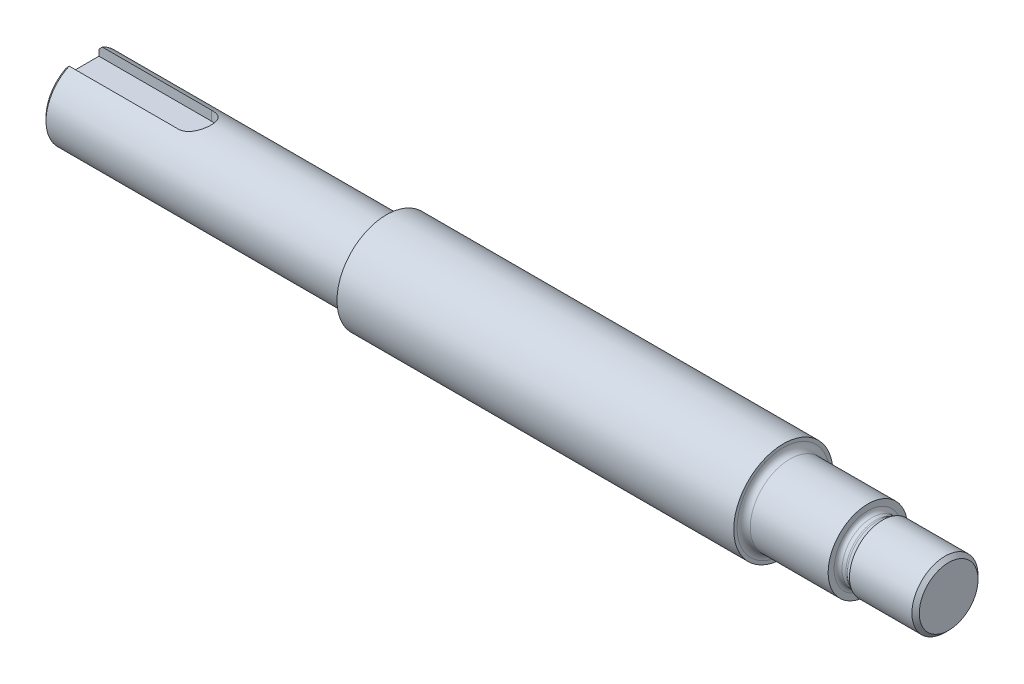
ISO-10303-21;
HEADER;
FILE_DESCRIPTION(('STEP AP214'),'2;1');
FILE_NAME('part.step','',(''),(''),'','','');
FILE_SCHEMA(('AUTOMOTIVE_DESIGN { 1 0 10303 214 1 1 1 1 }'));
ENDSEC;
DATA;
#1=APPLICATION_CONTEXT('core data for automotive mechanical design processes');
#2=APPLICATION_PROTOCOL_DEFINITION('international standard','automotive_design',2000,#1);
#3=PRODUCT_CONTEXT('',#1,'mechanical');
#4=PRODUCT('Part','Part','',(#3));
#5=PRODUCT_RELATED_PRODUCT_CATEGORY('part','',(#4));
#6=PRODUCT_DEFINITION_FORMATION('','',#4);
#7=PRODUCT_DEFINITION_CONTEXT('part definition',#1,'design');
#8=PRODUCT_DEFINITION('design','',#6,#7);
#9=PRODUCT_DEFINITION_SHAPE('','',#8);
#10=(LENGTH_UNIT() NAMED_UNIT(*) SI_UNIT(.MILLI.,.METRE.));
#11=(NAMED_UNIT(*) PLANE_ANGLE_UNIT() SI_UNIT($,.RADIAN.));
#12=(NAMED_UNIT(*) SI_UNIT($,.STERADIAN.) SOLID_ANGLE_UNIT());
#13=UNCERTAINTY_MEASURE_WITH_UNIT(LENGTH_MEASURE(1.E-05),#10,'distance_accuracy_value','');
#14=(GEOMETRIC_REPRESENTATION_CONTEXT(3) GLOBAL_UNCERTAINTY_ASSIGNED_CONTEXT((#13)) GLOBAL_UNIT_ASSIGNED_CONTEXT((#10,
#11,#12)) REPRESENTATION_CONTEXT('',''));
#15=CARTESIAN_POINT('',(0.,0.,0.));
#16=DIRECTION('',(0.,0.,1.));
#17=DIRECTION('',(1.,0.,0.));
#18=AXIS2_PLACEMENT_3D('',#15,#16,#17);
#19=CARTESIAN_POINT('',(0.,0.,0.));
#20=DIRECTION('',(-1.,0.,0.));
#21=DIRECTION('',(0.,0.,1.));
#22=AXIS2_PLACEMENT_3D('',#19,#20,#21);
#23=PLANE('',#22);
#24=DIRECTION('',(0.,0.,1.));
#25=VECTOR('',#24,1.);
#26=CARTESIAN_POINT('',(0.,4.,0.));
#27=LINE('',#26,#25);
#28=CARTESIAN_POINT('',(0.,4.,-2.5));
#29=VERTEX_POINT('',#28);
#30=CARTESIAN_POINT('',(0.,4.,2.5));
#31=VERTEX_POINT('',#30);
#32=EDGE_CURVE('E12',#29,#31,#27,.T.);
#33=ORIENTED_EDGE('',*,*,#32,.F.);
#34=DIRECTION('',(0.,1.,0.));
#35=VECTOR('',#34,1.);
#36=CARTESIAN_POINT('',(0.,0.,-2.5));
#37=LINE('',#36,#35);
#38=CARTESIAN_POINT('',(0.,4.89897948556635,-2.5));
#39=VERTEX_POINT('',#38);
#40=EDGE_CURVE('E291',#29,#39,#37,.T.);
#41=ORIENTED_EDGE('',*,*,#40,.T.);
#42=CARTESIAN_POINT('',(0.,0.,0.));
#43=DIRECTION('',(-1.,0.,0.));
#44=DIRECTION('',(0.,0.,1.));
#45=AXIS2_PLACEMENT_3D('',#42,#43,#44);
#46=CIRCLE('',#45,5.49999999999999);
#47=CARTESIAN_POINT('',(0.,4.89897948556635,2.5));
#48=VERTEX_POINT('',#47);
#49=EDGE_CURVE('E372',#39,#48,#46,.T.);
#50=ORIENTED_EDGE('',*,*,#49,.T.);
#51=DIRECTION('',(0.,-1.,0.));
#52=VECTOR('',#51,1.);
#53=CARTESIAN_POINT('',(0.,0.,2.5));
#54=LINE('',#53,#52);
#55=EDGE_CURVE('E244',#48,#31,#54,.T.);
#56=ORIENTED_EDGE('',*,*,#55,.T.);
#57=EDGE_LOOP('',(#33,#41,#50,#56));
#58=FACE_BOUND('',#57,.T.);
#59=ADVANCED_FACE('F226',(#58),#23,.T.);
#60=CARTESIAN_POINT('',(0.,0.,0.));
#61=DIRECTION('',(-1.,0.,0.));
#62=DIRECTION('',(0.,0.,1.));
#63=AXIS2_PLACEMENT_3D('',#60,#61,#62);
#64=CYLINDRICAL_SURFACE('',#63,6.);
#65=CARTESIAN_POINT('',(45.,0.,0.));
#66=DIRECTION('',(-1.,0.,0.));
#67=DIRECTION('',(0.,0.,1.));
#68=AXIS2_PLACEMENT_3D('',#65,#66,#67);
#69=CIRCLE('',#68,6.);
#70=CARTESIAN_POINT('',(45.,0.,6.));
#71=VERTEX_POINT('',#70);
#72=EDGE_CURVE('E356',#71,#71,#69,.T.);
#73=ORIENTED_EDGE('',*,*,#72,.T.);
#74=EDGE_LOOP('',(#73));
#75=FACE_BOUND('',#74,.T.);
#76=CARTESIAN_POINT('',(0.500000000000017,0.,0.));
#77=DIRECTION('',(-1.,0.,0.));
#78=DIRECTION('',(0.,0.,1.));
#79=AXIS2_PLACEMENT_3D('',#76,#77,#78);
#80=CIRCLE('',#79,6.);
#81=CARTESIAN_POINT('',(0.500000000000017,5.45435605731786,2.5));
#82=VERTEX_POINT('',#81);
#83=CARTESIAN_POINT('',(0.499999999999799,5.45435605731776,-2.5));
#84=VERTEX_POINT('',#83);
#85=EDGE_CURVE('E376',#82,#84,#80,.F.);
#86=ORIENTED_EDGE('',*,*,#85,.T.);
#87=DIRECTION('',(-1.,0.,0.));
#88=VECTOR('',#87,1.);
#89=CARTESIAN_POINT('',(0.,5.45435605731786,-2.5));
#90=LINE('',#89,#88);
#91=CARTESIAN_POINT('',(17.,5.45435605731786,-2.5));
#92=VERTEX_POINT('',#91);
#93=EDGE_CURVE('E252',#84,#92,#90,.F.);
#94=ORIENTED_EDGE('',*,*,#93,.T.);
#95=CARTESIAN_POINT('',(17.,5.45435605731786,-2.5));
#96=CARTESIAN_POINT('',(17.066990421397,5.4543414367274,-2.50001024965806));
#97=CARTESIAN_POINT('',(17.1339728576071,5.45558986423115,-2.49730766074456));
#98=CARTESIAN_POINT('',(17.267391217606,5.46050344433192,-2.48655699342007));
#99=CARTESIAN_POINT('',(17.3338273558978,5.46416759753227,-2.47851112553775));
#100=CARTESIAN_POINT('',(17.4654018598714,5.47378318611766,-2.45719882557102));
#101=CARTESIAN_POINT('',(17.5305445048847,5.47972494833872,-2.44395446621823));
#102=CARTESIAN_POINT('',(17.6593476505706,5.49369035165668,-2.41239773056354));
#103=CARTESIAN_POINT('',(17.7230080494492,5.50171413528084,-2.39408500729503));
#104=CARTESIAN_POINT('',(17.9109704766892,5.52852216859036,-2.33184505253746));
#105=CARTESIAN_POINT('',(18.0325349409199,5.55006534458072,-2.28056973965757));
#106=CARTESIAN_POINT('',(18.265394969978,5.5980502687434,-2.16009667726577));
#107=CARTESIAN_POINT('',(18.3766796624162,5.62449711638193,-2.09088024017803));
#108=CARTESIAN_POINT('',(18.5926555180297,5.68111739532849,-1.93194216605247));
#109=CARTESIAN_POINT('',(18.6966314637585,5.71141645652258,-1.84129131772597));
#110=CARTESIAN_POINT('',(18.8884169369691,5.77129106659512,-1.6440247325164));
#111=CARTESIAN_POINT('',(18.9762230019235,5.80086645933831,-1.53740558511416));
#112=CARTESIAN_POINT('',(19.1368988289762,5.85751079611205,-1.30552662419109));
#113=CARTESIAN_POINT('',(19.2089534877025,5.88441492036275,-1.17965801419142));
#114=CARTESIAN_POINT('',(19.3305523948046,5.93113050419022,-0.916263349803656));
#115=CARTESIAN_POINT('',(19.3801067434128,5.95094514533806,-0.778742558960749));
#116=CARTESIAN_POINT('',(19.4526785710471,5.98035028996094,-0.503538212911765));
#117=CARTESIAN_POINT('',(19.4769429460133,5.99041924152298,-0.366235636683352));
#118=CARTESIAN_POINT('',(19.502275267891,6.00093656296527,-0.0891608856613083));
#119=CARTESIAN_POINT('',(19.5033522066188,6.00138866214753,0.0506103107853688));
#120=CARTESIAN_POINT('',(19.4829313516378,5.99290254661358,0.319586702683723));
#121=CARTESIAN_POINT('',(19.4628034512649,5.98453414521297,0.448917245472143));
#122=CARTESIAN_POINT('',(19.4028930910878,5.96013005449445,0.70216796354397));
#123=CARTESIAN_POINT('',(19.3631095260154,5.94409393401056,0.826087834150438));
#124=CARTESIAN_POINT('',(19.2645442163381,5.90559715444489,1.06727556823007));
#125=CARTESIAN_POINT('',(19.2054818206956,5.88304219015531,1.1844130633202));
#126=CARTESIAN_POINT('',(19.0703092180309,5.83371457161593,1.40742238732223));
#127=CARTESIAN_POINT('',(18.9941928006955,5.80694038196897,1.51329009151026));
#128=CARTESIAN_POINT('',(18.8208409664575,5.74963576527152,1.71867537807254));
#129=CARTESIAN_POINT('',(18.7224958287417,5.71897359653013,1.81722082953265));
#130=CARTESIAN_POINT('',(18.5105893535751,5.65876079183101,1.99685313522822));
#131=CARTESIAN_POINT('',(18.3970203460054,5.62921072584973,2.07793113494236));
#132=CARTESIAN_POINT('',(18.1531453498455,5.57361619012468,2.22284514508404));
#133=CARTESIAN_POINT('',(18.0224071265261,5.54772171984214,2.28601504206341));
#134=CARTESIAN_POINT('',(17.7508546265431,5.50417661447929,2.38897619183128));
#135=CARTESIAN_POINT('',(17.6100594530022,5.48651080537515,2.4288105117282));
#136=CARTESIAN_POINT('',(17.3898491565922,5.46773287951056,2.47065526537902));
#137=CARTESIAN_POINT('',(17.3123689332134,5.46274303006064,2.48164099212927));
#138=CARTESIAN_POINT('',(17.1566098186605,5.45604541462647,2.49631631258703));
#139=CARTESIAN_POINT('',(17.0783312227393,5.45433647659977,2.50000851178052));
#140=CARTESIAN_POINT('',(17.,5.45435605731786,2.5));
#141=B_SPLINE_CURVE_WITH_KNOTS('',3,(#95,#96,#97,#98,#99,#100,#101,#102,#103,#104,#105,#106,
#107,#108,#109,#110,#111,#112,#113,#114,#115,#116,#117,#118,#119,#120,#121,#122,#123,#124,#125,
#126,#127,#128,#129,#130,#131,#132,#133,#134,#135,#136,#137,#138,#139,#140),.UNSPECIFIED.,.F.,
.F.,(4,2,2,2,2,2,2,2,2,2,2,2,2,2,2,2,2,2,2,2,2,2,4),(0.,0.200891876435008,0.401700695097973,
0.601665948391963,0.801644894158599,1.20075599352942,1.6002844916061,2.02212344548655,
2.44405262481498,2.88432120276328,3.32439195134774,3.74155898035476,4.15856423395471,
4.55019084443641,4.94183947919071,5.33946474085078,5.73723503589979,6.16301556467703,
6.58901142297275,7.02923147484728,7.4686364954648,7.70350874445825,7.93829707423866),.UNSPECIFIED.);
#142=CARTESIAN_POINT('',(17.,5.45435605731786,2.5));
#143=VERTEX_POINT('',#142);
#144=EDGE_CURVE('E237',#92,#143,#141,.T.);
#145=ORIENTED_EDGE('',*,*,#144,.T.);
#146=DIRECTION('',(-1.,0.,0.));
#147=VECTOR('',#146,1.);
#148=CARTESIAN_POINT('',(0.,5.45435605731786,2.5));
#149=LINE('',#148,#147);
#150=EDGE_CURVE('E284',#143,#82,#149,.T.);
#151=ORIENTED_EDGE('',*,*,#150,.T.);
#152=EDGE_LOOP('',(#86,#94,#145,#151));
#153=FACE_BOUND('',#152,.T.);
#154=ADVANCED_FACE('F413',(#75,#153),#64,.T.);
#155=CARTESIAN_POINT('',(0.,0.,0.));
#156=DIRECTION('',(1.,0.,0.));
#157=DIRECTION('',(0.,0.,-1.));
#158=AXIS2_PLACEMENT_3D('',#155,#156,#157);
#159=CONICAL_SURFACE('',#158,5.49999999999999,0.785398163397441);
#160=ORIENTED_EDGE('',*,*,#49,.F.);
#161=CARTESIAN_POINT('',(-2.06175281280883,2.36041176921064,-2.5));
#162=CARTESIAN_POINT('',(-2.01394475397447,2.43003661537907,-2.5));
#163=CARTESIAN_POINT('',(-1.96539366837906,2.49914412103413,-2.5));
#164=CARTESIAN_POINT('',(-1.8670237978404,2.63644147141834,-2.5));
#165=CARTESIAN_POINT('',(-1.8172051393184,2.70463140663225,-2.5));
#166=CARTESIAN_POINT('',(-1.66619894009737,2.90796953010818,-2.5));
#167=CARTESIAN_POINT('',(-1.56342461092271,3.04193862719923,-2.5));
#168=CARTESIAN_POINT('',(-1.35490770434356,3.30734106462791,-2.5));
#169=CARTESIAN_POINT('',(-1.24916779789332,3.43877651756389,-2.5));
#170=CARTESIAN_POINT('',(-1.03538561102648,3.69978141090577,-2.5));
#171=CARTESIAN_POINT('',(-0.927343076492302,3.82935064268389,-2.5));
#172=CARTESIAN_POINT('',(-0.709637065256824,4.08684420579855,-2.5));
#173=CARTESIAN_POINT('',(-0.599975737747148,4.21477035869308,-2.5));
#174=CARTESIAN_POINT('',(-0.37928339884431,4.46942490932702,-2.5));
#175=CARTESIAN_POINT('',(-0.268252440777538,4.59615335336187,-2.5));
#176=CARTESIAN_POINT('',(0.0665241148851471,4.97496249704816,-2.5));
#177=CARTESIAN_POINT('',(0.29189874404684,5.22560298461509,-2.5));
#178=CARTESIAN_POINT('',(0.686584004264704,5.6594708461063,-2.5));
#179=CARTESIAN_POINT('',(0.855245349383734,5.84329200676016,-2.5));
#180=CARTESIAN_POINT('',(1.19376958005533,6.20979019811357,-2.5));
#181=CARTESIAN_POINT('',(1.36363234151292,6.39246734340768,-2.5));
#182=CARTESIAN_POINT('',(1.70443176538093,6.75707362676224,-2.5));
#183=CARTESIAN_POINT('',(1.87536913992032,6.93900209824967,-2.5));
#184=CARTESIAN_POINT('',(2.218024761786,7.30215443708114,-2.5));
#185=CARTESIAN_POINT('',(2.38974308033959,7.48337823724012,-2.5));
#186=CARTESIAN_POINT('',(2.56175281280884,7.66432374152024,-2.5));
#187=B_SPLINE_CURVE_WITH_KNOTS('',3,(#161,#162,#163,#164,#165,#166,#167,#168,#169,#170,#171,
#172,#173,#174,#175,#176,#177,#178,#179,#180,#181,#182,#183,#184,#185,#186),.UNSPECIFIED.,.F.,
.F.,(4,2,2,2,2,2,2,2,2,2,2,2,4),(0.,0.253361589736587,0.506698008768662,1.01317878643961,
1.51921718977558,2.02531173159408,2.53078593021579,3.03624050999623,4.04740215903366,
4.79581734399679,5.54415632195695,6.29305861189881,7.04203063430377),.UNSPECIFIED.);
#188=EDGE_CURVE('E388',#39,#84,#187,.T.);
#189=ORIENTED_EDGE('',*,*,#188,.T.);
#190=ORIENTED_EDGE('',*,*,#85,.F.);
#191=CARTESIAN_POINT('',(2.56175281280885,7.66432374152023,2.5));
#192=CARTESIAN_POINT('',(2.35964348840291,7.45169986546314,2.5));
#193=CARTESIAN_POINT('',(2.15792493005194,7.23870137129957,2.5));
#194=CARTESIAN_POINT('',(1.75558602638068,6.81166549413486,2.5));
#195=CARTESIAN_POINT('',(1.55496569388227,6.59762809905927,2.5));
#196=CARTESIAN_POINT('',(1.15535677289204,6.16845752657041,2.5));
#197=CARTESIAN_POINT('',(0.956366678836541,5.95332575289029,2.5));
#198=CARTESIAN_POINT('',(0.560284990985788,5.52127964491234,2.5));
#199=CARTESIAN_POINT('',(0.363193581825832,5.30436514098102,2.5));
#200=CARTESIAN_POINT('',(-0.0285510942154846,4.8678578389933,2.5));
#201=CARTESIAN_POINT('',(-0.223201051255747,4.64826206545945,2.5));
#202=CARTESIAN_POINT('',(-0.608570055468194,4.20571324386406,2.5));
#203=CARTESIAN_POINT('',(-0.799290004049328,3.9827609864329,2.5));
#204=CARTESIAN_POINT('',(-1.08095604501516,3.64442132134884,2.5));
#205=CARTESIAN_POINT('',(-1.17416432438215,3.53091945299898,2.5));
#206=CARTESIAN_POINT('',(-1.35862799270255,3.30235252683684,2.5));
#207=CARTESIAN_POINT('',(-1.44988355232162,3.18728760708248,2.5));
#208=CARTESIAN_POINT('',(-1.62995148234885,2.9551071289415,2.5));
#209=CARTESIAN_POINT('',(-1.71876189262186,2.83799004183828,2.5));
#210=CARTESIAN_POINT('',(-1.84947212594601,2.66044235115342,2.5));
#211=CARTESIAN_POINT('',(-1.89263096341056,2.60093865736721,2.5));
#212=CARTESIAN_POINT('',(-1.97796609357188,2.48122489011144,2.5));
#213=CARTESIAN_POINT('',(-2.02014231464841,2.42101476562998,2.5));
#214=CARTESIAN_POINT('',(-2.06175281280841,2.36041176921125,2.5));
#215=B_SPLINE_CURVE_WITH_KNOTS('',3,(#191,#192,#193,#194,#195,#196,#197,#198,#199,#200,#201,
#202,#203,#204,#205,#206,#207,#208,#209,#210,#211,#212,#213,#214),.UNSPECIFIED.,.F.,.F.,(4,2,2,
2,2,2,2,2,2,2,2,4),(0.,0.880067668652409,1.7601455903537,2.6392896575659,3.51851837016957,
4.39883236708537,5.27894215070597,5.71953235599018,6.16008389556549,6.60097888262755,
6.82149293574366,7.04202301156287),.UNSPECIFIED.);
#216=EDGE_CURVE('E380',#82,#48,#215,.T.);
#217=ORIENTED_EDGE('',*,*,#216,.T.);
#218=EDGE_LOOP('',(#160,#189,#190,#217));
#219=FACE_BOUND('',#218,.T.);
#220=ADVANCED_FACE('F229',(#219),#159,.T.);
#221=CARTESIAN_POINT('',(46.,0.,6.));
#222=DIRECTION('',(-1.,0.,0.));
#223=DIRECTION('',(0.,0.,1.));
#224=AXIS2_PLACEMENT_3D('',#221,#222,#223);
#225=PLANE('',#224);
#226=CARTESIAN_POINT('',(46.,0.,0.));
#227=DIRECTION('',(-1.,0.,0.));
#228=DIRECTION('',(0.,0.,1.));
#229=AXIS2_PLACEMENT_3D('',#226,#227,#228);
#230=CIRCLE('',#229,7.);
#231=CARTESIAN_POINT('',(46.,0.,7.));
#232=VERTEX_POINT('',#231);
#233=EDGE_CURVE('E360',#232,#232,#230,.F.);
#234=ORIENTED_EDGE('',*,*,#233,.T.);
#235=EDGE_LOOP('',(#234));
#236=FACE_BOUND('',#235,.T.);
#237=CARTESIAN_POINT('',(46.,0.,0.));
#238=DIRECTION('',(-1.,0.,0.));
#239=DIRECTION('',(0.,0.,1.));
#240=AXIS2_PLACEMENT_3D('',#237,#238,#239);
#241=CIRCLE('',#240,7.5);
#242=CARTESIAN_POINT('',(46.,0.,7.5));
#243=VERTEX_POINT('',#242);
#244=EDGE_CURVE('E352',#243,#243,#241,.T.);
#245=ORIENTED_EDGE('',*,*,#244,.T.);
#246=EDGE_LOOP('',(#245));
#247=FACE_BOUND('',#246,.T.);
#248=ADVANCED_FACE('F419',(#236,#247),#225,.T.);
#249=CARTESIAN_POINT('',(0.,0.,0.));
#250=DIRECTION('',(-1.,0.,0.));
#251=DIRECTION('',(0.,0.,1.));
#252=AXIS2_PLACEMENT_3D('',#249,#250,#251);
#253=CYLINDRICAL_SURFACE('',#252,7.5);
#254=CARTESIAN_POINT('',(106.,0.,0.));
#255=DIRECTION('',(-1.,0.,0.));
#256=DIRECTION('',(0.,0.,1.));
#257=AXIS2_PLACEMENT_3D('',#254,#255,#256);
#258=CIRCLE('',#257,7.5);
#259=CARTESIAN_POINT('',(106.,0.,7.5));
#260=VERTEX_POINT('',#259);
#261=EDGE_CURVE('E348',#260,#260,#258,.T.);
#262=ORIENTED_EDGE('',*,*,#261,.T.);
#263=EDGE_LOOP('',(#262));
#264=FACE_BOUND('',#263,.T.);
#265=ORIENTED_EDGE('',*,*,#244,.F.);
#266=EDGE_LOOP('',(#265));
#267=FACE_BOUND('',#266,.T.);
#268=ADVANCED_FACE('F445',(#264,#267),#253,.T.);
#269=CARTESIAN_POINT('',(106.,0.,7.5));
#270=DIRECTION('',(1.,0.,0.));
#271=DIRECTION('',(0.,0.,-1.));
#272=AXIS2_PLACEMENT_3D('',#269,#270,#271);
#273=PLANE('',#272);
#274=CARTESIAN_POINT('',(106.,0.,0.));
#275=DIRECTION('',(1.,0.,0.));
#276=DIRECTION('',(0.,0.,-1.));
#277=AXIS2_PLACEMENT_3D('',#274,#275,#276);
#278=CIRCLE('',#277,7.);
#279=CARTESIAN_POINT('',(106.,0.,-7.));
#280=VERTEX_POINT('',#279);
#281=EDGE_CURVE('E364',#280,#280,#278,.F.);
#282=ORIENTED_EDGE('',*,*,#281,.T.);
#283=EDGE_LOOP('',(#282));
#284=FACE_BOUND('',#283,.T.);
#285=ORIENTED_EDGE('',*,*,#261,.F.);
#286=EDGE_LOOP('',(#285));
#287=FACE_BOUND('',#286,.T.);
#288=ADVANCED_FACE('F442',(#284,#287),#273,.T.);
#289=CARTESIAN_POINT('',(0.,0.,0.));
#290=DIRECTION('',(-1.,0.,0.));
#291=DIRECTION('',(0.,0.,1.));
#292=AXIS2_PLACEMENT_3D('',#289,#290,#291);
#293=CYLINDRICAL_SURFACE('',#292,6.);
#294=CARTESIAN_POINT('',(118.773205080757,0.,0.));
#295=DIRECTION('',(-1.,0.,0.));
#296=DIRECTION('',(0.,0.,1.));
#297=AXIS2_PLACEMENT_3D('',#294,#295,#296);
#298=CIRCLE('',#297,6.);
#299=CARTESIAN_POINT('',(118.773205080757,0.,6.));
#300=VERTEX_POINT('',#299);
#301=EDGE_CURVE('E324',#300,#300,#298,.T.);
#302=ORIENTED_EDGE('',*,*,#301,.T.);
#303=EDGE_LOOP('',(#302));
#304=FACE_BOUND('',#303,.T.);
#305=CARTESIAN_POINT('',(107.,0.,0.));
#306=DIRECTION('',(1.,0.,0.));
#307=DIRECTION('',(0.,0.,-1.));
#308=AXIS2_PLACEMENT_3D('',#305,#306,#307);
#309=CIRCLE('',#308,6.);
#310=CARTESIAN_POINT('',(107.,0.,-6.));
#311=VERTEX_POINT('',#310);
#312=EDGE_CURVE('E368',#311,#311,#309,.T.);
#313=ORIENTED_EDGE('',*,*,#312,.T.);
#314=EDGE_LOOP('',(#313));
#315=FACE_BOUND('',#314,.T.);
#316=ADVANCED_FACE('F427',(#304,#315),#293,.T.);
#317=CARTESIAN_POINT('',(45.,0.,0.));
#318=DIRECTION('',(-1.,0.,0.));
#319=DIRECTION('',(0.,0.,1.));
#320=AXIS2_PLACEMENT_3D('',#317,#318,#319);
#321=TOROIDAL_SURFACE('',#320,7.,1.);
#322=ORIENTED_EDGE('',*,*,#233,.F.);
#323=EDGE_LOOP('',(#322));
#324=FACE_BOUND('',#323,.T.);
#325=ORIENTED_EDGE('',*,*,#72,.F.);
#326=EDGE_LOOP('',(#325));
#327=FACE_BOUND('',#326,.T.);
#328=ADVANCED_FACE('F424',(#324,#327),#321,.F.);
#329=CARTESIAN_POINT('',(107.,0.,0.));
#330=DIRECTION('',(1.,0.,0.));
#331=DIRECTION('',(0.,0.,-1.));
#332=AXIS2_PLACEMENT_3D('',#329,#330,#331);
#333=TOROIDAL_SURFACE('',#332,7.,1.);
#334=ORIENTED_EDGE('',*,*,#312,.F.);
#335=EDGE_LOOP('',(#334));
#336=FACE_BOUND('',#335,.T.);
#337=ORIENTED_EDGE('',*,*,#281,.F.);
#338=EDGE_LOOP('',(#337));
#339=FACE_BOUND('',#338,.T.);
#340=ADVANCED_FACE('F426',(#336,#339),#333,.F.);
#341=CARTESIAN_POINT('',(131.,0.,0.));
#342=DIRECTION('',(-1.,0.,0.));
#343=DIRECTION('',(0.,0.,1.));
#344=AXIS2_PLACEMENT_3D('',#341,#342,#343);
#345=CYLINDRICAL_SURFACE('',#344,5.);
#346=CARTESIAN_POINT('',(121.,0.,0.));
#347=DIRECTION('',(-1.,0.,0.));
#348=DIRECTION('',(0.,0.,1.));
#349=AXIS2_PLACEMENT_3D('',#346,#347,#348);
#350=CIRCLE('',#349,5.);
#351=CARTESIAN_POINT('',(121.,0.,5.));
#352=VERTEX_POINT('',#351);
#353=EDGE_CURVE('E344',#352,#352,#350,.T.);
#354=ORIENTED_EDGE('',*,*,#353,.F.);
#355=EDGE_LOOP('',(#354));
#356=FACE_BOUND('',#355,.T.);
#357=CARTESIAN_POINT('',(130.4455,0.,0.));
#358=DIRECTION('',(-1.,0.,0.));
#359=DIRECTION('',(0.,0.,1.));
#360=AXIS2_PLACEMENT_3D('',#357,#358,#359);
#361=CIRCLE('',#360,5.);
#362=CARTESIAN_POINT('',(130.4455,0.,5.));
#363=VERTEX_POINT('',#362);
#364=EDGE_CURVE('E316',#363,#363,#361,.T.);
#365=ORIENTED_EDGE('',*,*,#364,.T.);
#366=EDGE_LOOP('',(#365));
#367=FACE_BOUND('',#366,.T.);
#368=ADVANCED_FACE('F430',(#356,#367),#345,.T.);
#369=CARTESIAN_POINT('',(121.,0.,0.));
#370=DIRECTION('',(1.,0.,0.));
#371=DIRECTION('',(0.,0.,-1.));
#372=AXIS2_PLACEMENT_3D('',#369,#370,#371);
#373=CONICAL_SURFACE('',#372,5.,0.523598775598298);
#374=CARTESIAN_POINT('',(120.273205080757,0.,0.));
#375=DIRECTION('',(-1.,0.,0.));
#376=DIRECTION('',(0.,0.,1.));
#377=AXIS2_PLACEMENT_3D('',#374,#375,#376);
#378=CIRCLE('',#377,4.58038475772934);
#379=CARTESIAN_POINT('',(120.273205080757,0.,4.58038475772934));
#380=VERTEX_POINT('',#379);
#381=EDGE_CURVE('E340',#380,#380,#378,.T.);
#382=ORIENTED_EDGE('',*,*,#381,.F.);
#383=EDGE_LOOP('',(#382));
#384=FACE_BOUND('',#383,.T.);
#385=ORIENTED_EDGE('',*,*,#353,.T.);
#386=EDGE_LOOP('',(#385));
#387=FACE_BOUND('',#386,.T.);
#388=ADVANCED_FACE('F435',(#384,#387),#373,.T.);
#389=CARTESIAN_POINT('',(119.973205080757,0.,0.));
#390=DIRECTION('',(-1.,0.,0.));
#391=DIRECTION('',(0.,0.,1.));
#392=AXIS2_PLACEMENT_3D('',#389,#390,#391);
#393=TOROIDAL_SURFACE('',#392,5.1,0.6);
#394=CARTESIAN_POINT('',(119.973205080757,0.,0.));
#395=DIRECTION('',(-1.,0.,0.));
#396=DIRECTION('',(0.,0.,1.));
#397=AXIS2_PLACEMENT_3D('',#394,#395,#396);
#398=CIRCLE('',#397,4.5);
#399=CARTESIAN_POINT('',(119.973205080757,0.,4.5));
#400=VERTEX_POINT('',#399);
#401=EDGE_CURVE('E336',#400,#400,#398,.T.);
#402=ORIENTED_EDGE('',*,*,#401,.F.);
#403=EDGE_LOOP('',(#402));
#404=FACE_BOUND('',#403,.T.);
#405=ORIENTED_EDGE('',*,*,#381,.T.);
#406=EDGE_LOOP('',(#405));
#407=FACE_BOUND('',#406,.T.);
#408=ADVANCED_FACE('F588',(#404,#407),#393,.F.);
#409=CARTESIAN_POINT('',(131.,0.,0.));
#410=DIRECTION('',(-1.,0.,0.));
#411=DIRECTION('',(0.,0.,1.));
#412=AXIS2_PLACEMENT_3D('',#409,#410,#411);
#413=CYLINDRICAL_SURFACE('',#412,4.5);
#414=CARTESIAN_POINT('',(119.373205080757,0.,0.));
#415=DIRECTION('',(-1.,0.,0.));
#416=DIRECTION('',(0.,0.,1.));
#417=AXIS2_PLACEMENT_3D('',#414,#415,#416);
#418=CIRCLE('',#417,4.5);
#419=CARTESIAN_POINT('',(119.373205080757,0.,4.5));
#420=VERTEX_POINT('',#419);
#421=EDGE_CURVE('E332',#420,#420,#418,.T.);
#422=ORIENTED_EDGE('',*,*,#421,.F.);
#423=EDGE_LOOP('',(#422));
#424=FACE_BOUND('',#423,.T.);
#425=ORIENTED_EDGE('',*,*,#401,.T.);
#426=EDGE_LOOP('',(#425));
#427=FACE_BOUND('',#426,.T.);
#428=ADVANCED_FACE('F580',(#424,#427),#413,.T.);
#429=CARTESIAN_POINT('',(119.373205080757,0.,0.));
#430=DIRECTION('',(-1.,0.,0.));
#431=DIRECTION('',(0.,0.,1.));
#432=AXIS2_PLACEMENT_3D('',#429,#430,#431);
#433=TOROIDAL_SURFACE('',#432,5.1,0.6);
#434=CARTESIAN_POINT('',(118.773205080757,0.,0.));
#435=DIRECTION('',(-1.,0.,0.));
#436=DIRECTION('',(0.,0.,1.));
#437=AXIS2_PLACEMENT_3D('',#434,#435,#436);
#438=CIRCLE('',#437,5.1);
#439=CARTESIAN_POINT('',(118.773205080757,0.,5.1));
#440=VERTEX_POINT('',#439);
#441=EDGE_CURVE('E328',#440,#440,#438,.T.);
#442=ORIENTED_EDGE('',*,*,#441,.F.);
#443=EDGE_LOOP('',(#442));
#444=FACE_BOUND('',#443,.T.);
#445=ORIENTED_EDGE('',*,*,#421,.T.);
#446=EDGE_LOOP('',(#445));
#447=FACE_BOUND('',#446,.T.);
#448=ADVANCED_FACE('F573',(#444,#447),#433,.F.);
#449=CARTESIAN_POINT('',(118.773205080757,5.1,0.));
#450=DIRECTION('',(-1.,0.,0.));
#451=DIRECTION('',(0.,0.,1.));
#452=AXIS2_PLACEMENT_3D('',#449,#450,#451);
#453=PLANE('',#452);
#454=ORIENTED_EDGE('',*,*,#301,.F.);
#455=EDGE_LOOP('',(#454));
#456=FACE_BOUND('',#455,.T.);
#457=ORIENTED_EDGE('',*,*,#441,.T.);
#458=EDGE_LOOP('',(#457));
#459=FACE_BOUND('',#458,.T.);
#460=ADVANCED_FACE('F566',(#456,#459),#453,.F.);
#461=CARTESIAN_POINT('',(131.,0.,0.));
#462=DIRECTION('',(-1.,0.,0.));
#463=DIRECTION('',(0.,0.,1.));
#464=AXIS2_PLACEMENT_3D('',#461,#462,#463);
#465=CONICAL_SURFACE('',#464,4.4455,0.785398163397462);
#466=ORIENTED_EDGE('',*,*,#364,.F.);
#467=EDGE_LOOP('',(#466));
#468=FACE_BOUND('',#467,.T.);
#469=CARTESIAN_POINT('',(131.,0.,0.));
#470=DIRECTION('',(-1.,0.,0.));
#471=DIRECTION('',(0.,0.,1.));
#472=AXIS2_PLACEMENT_3D('',#469,#470,#471);
#473=CIRCLE('',#472,4.4455);
#474=CARTESIAN_POINT('',(131.,0.,4.4455));
#475=VERTEX_POINT('',#474);
#476=EDGE_CURVE('E320',#475,#475,#473,.T.);
#477=ORIENTED_EDGE('',*,*,#476,.T.);
#478=EDGE_LOOP('',(#477));
#479=FACE_BOUND('',#478,.T.);
#480=ADVANCED_FACE('F405',(#468,#479),#465,.T.);
#481=CARTESIAN_POINT('',(131.,0.,6.));
#482=DIRECTION('',(1.,0.,0.));
#483=DIRECTION('',(0.,0.,-1.));
#484=AXIS2_PLACEMENT_3D('',#481,#482,#483);
#485=PLANE('',#484);
#486=ORIENTED_EDGE('',*,*,#476,.F.);
#487=EDGE_LOOP('',(#486));
#488=FACE_BOUND('',#487,.T.);
#489=ADVANCED_FACE('F404',(#488),#485,.T.);
#490=CARTESIAN_POINT('',(17.,7.5,0.));
#491=DIRECTION('',(0.,-1.,0.));
#492=DIRECTION('',(0.,0.,-1.));
#493=AXIS2_PLACEMENT_3D('',#490,#491,#492);
#494=CYLINDRICAL_SURFACE('',#493,2.5);
#495=DIRECTION('',(0.,-1.,0.));
#496=VECTOR('',#495,1.);
#497=CARTESIAN_POINT('',(17.,7.5,-2.5));
#498=LINE('',#497,#496);
#499=CARTESIAN_POINT('',(17.,4.,-2.5));
#500=VERTEX_POINT('',#499);
#501=EDGE_CURVE('E276',#92,#500,#498,.T.);
#502=ORIENTED_EDGE('',*,*,#501,.T.);
#503=CARTESIAN_POINT('',(17.,4.,0.));
#504=DIRECTION('',(0.,1.,0.));
#505=DIRECTION('',(0.,0.,-1.));
#506=AXIS2_PLACEMENT_3D('',#503,#504,#505);
#507=CIRCLE('',#506,2.5);
#508=CARTESIAN_POINT('',(17.,4.,2.5));
#509=VERTEX_POINT('',#508);
#510=EDGE_CURVE('E281',#509,#500,#507,.T.);
#511=ORIENTED_EDGE('',*,*,#510,.F.);
#512=DIRECTION('',(0.,-1.,0.));
#513=VECTOR('',#512,1.);
#514=CARTESIAN_POINT('',(17.,7.5,2.5));
#515=LINE('',#514,#513);
#516=EDGE_CURVE('E285',#143,#509,#515,.T.);
#517=ORIENTED_EDGE('',*,*,#516,.F.);
#518=ORIENTED_EDGE('',*,*,#144,.F.);
#519=EDGE_LOOP('',(#502,#511,#517,#518));
#520=FACE_BOUND('',#519,.T.);
#521=ADVANCED_FACE('F278',(#520),#494,.F.);
#522=CARTESIAN_POINT('',(-17.,7.5,-2.5));
#523=DIRECTION('',(0.,0.,1.));
#524=DIRECTION('',(1.,0.,0.));
#525=AXIS2_PLACEMENT_3D('',#522,#523,#524);
#526=PLANE('',#525);
#527=DIRECTION('',(-1.,0.,0.));
#528=VECTOR('',#527,1.);
#529=CARTESIAN_POINT('',(-17.,4.,-2.5));
#530=LINE('',#529,#528);
#531=EDGE_CURVE('E288',#500,#29,#530,.T.);
#532=ORIENTED_EDGE('',*,*,#531,.F.);
#533=ORIENTED_EDGE('',*,*,#501,.F.);
#534=ORIENTED_EDGE('',*,*,#93,.F.);
#535=ORIENTED_EDGE('',*,*,#188,.F.);
#536=ORIENTED_EDGE('',*,*,#40,.F.);
#537=EDGE_LOOP('',(#532,#533,#534,#535,#536));
#538=FACE_BOUND('',#537,.T.);
#539=ADVANCED_FACE('F289',(#538),#526,.T.);
#540=CARTESIAN_POINT('',(-17.,7.5,2.5));
#541=DIRECTION('',(0.,0.,-1.));
#542=DIRECTION('',(-1.,0.,0.));
#543=AXIS2_PLACEMENT_3D('',#540,#541,#542);
#544=PLANE('',#543);
#545=ORIENTED_EDGE('',*,*,#216,.F.);
#546=ORIENTED_EDGE('',*,*,#150,.F.);
#547=ORIENTED_EDGE('',*,*,#516,.T.);
#548=DIRECTION('',(1.,0.,0.));
#549=VECTOR('',#548,1.);
#550=CARTESIAN_POINT('',(-17.,4.,2.5));
#551=LINE('',#550,#549);
#552=EDGE_CURVE('E295',#31,#509,#551,.T.);
#553=ORIENTED_EDGE('',*,*,#552,.F.);
#554=ORIENTED_EDGE('',*,*,#55,.F.);
#555=EDGE_LOOP('',(#545,#546,#547,#553,#554));
#556=FACE_BOUND('',#555,.T.);
#557=ADVANCED_FACE('F394',(#556),#544,.T.);
#558=CARTESIAN_POINT('',(17.,4.,0.));
#559=DIRECTION('',(0.,-1.,0.));
#560=DIRECTION('',(0.,0.,-1.));
#561=AXIS2_PLACEMENT_3D('',#558,#559,#560);
#562=PLANE('',#561);
#563=ORIENTED_EDGE('',*,*,#32,.T.);
#564=ORIENTED_EDGE('',*,*,#552,.T.);
#565=ORIENTED_EDGE('',*,*,#510,.T.);
#566=ORIENTED_EDGE('',*,*,#531,.T.);
#567=EDGE_LOOP('',(#563,#564,#565,#566));
#568=FACE_BOUND('',#567,.T.);
#569=ADVANCED_FACE('F298',(#568),#562,.F.);
#570=CLOSED_SHELL('',(#59,#154,#220,#248,#268,#288,#316,#328,#340,#368,#388,#408,#428,#448,#460,
#480,#489,#521,#539,#557,#569));
#571=MANIFOLD_SOLID_BREP('B2',#570);
#572=ADVANCED_BREP_SHAPE_REPRESENTATION('',(#18,#571),#14);
#573=SHAPE_DEFINITION_REPRESENTATION(#9,#572);
ENDSEC;
END-ISO-10303-21;
